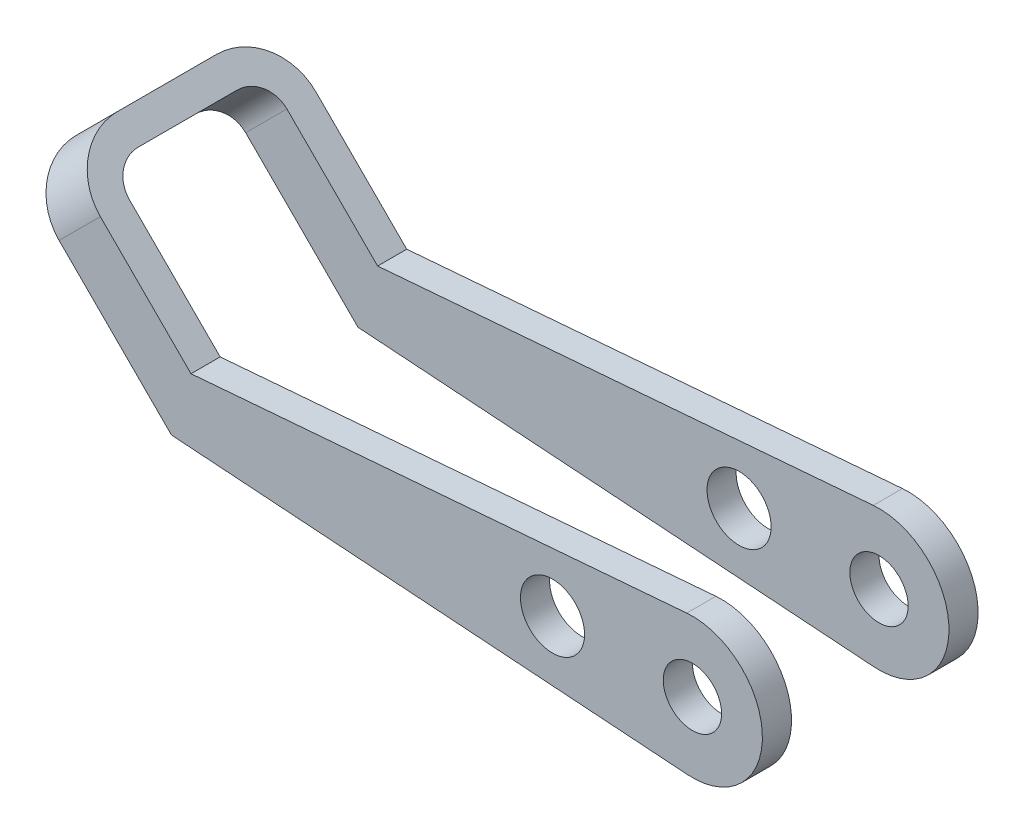
ISO-10303-21;
HEADER;
FILE_DESCRIPTION(('STEP AP214'),'2;1');
FILE_NAME('part.step','',(''),(''),'','','');
FILE_SCHEMA(('AUTOMOTIVE_DESIGN { 1 0 10303 214 1 1 1 1 }'));
ENDSEC;
DATA;
#1=APPLICATION_CONTEXT('core data for automotive mechanical design processes');
#2=APPLICATION_PROTOCOL_DEFINITION('international standard','automotive_design',2000,#1);
#3=PRODUCT_CONTEXT('',#1,'mechanical');
#4=PRODUCT('Part','Part','',(#3));
#5=PRODUCT_RELATED_PRODUCT_CATEGORY('part','',(#4));
#6=PRODUCT_DEFINITION_FORMATION('','',#4);
#7=PRODUCT_DEFINITION_CONTEXT('part definition',#1,'design');
#8=PRODUCT_DEFINITION('design','',#6,#7);
#9=PRODUCT_DEFINITION_SHAPE('','',#8);
#10=(LENGTH_UNIT() NAMED_UNIT(*) SI_UNIT(.MILLI.,.METRE.));
#11=(NAMED_UNIT(*) PLANE_ANGLE_UNIT() SI_UNIT($,.RADIAN.));
#12=(NAMED_UNIT(*) SI_UNIT($,.STERADIAN.) SOLID_ANGLE_UNIT());
#13=UNCERTAINTY_MEASURE_WITH_UNIT(LENGTH_MEASURE(1.E-05),#10,'distance_accuracy_value','');
#14=(GEOMETRIC_REPRESENTATION_CONTEXT(3) GLOBAL_UNCERTAINTY_ASSIGNED_CONTEXT((#13)) GLOBAL_UNIT_ASSIGNED_CONTEXT((#10,
#11,#12)) REPRESENTATION_CONTEXT('',''));
#15=CARTESIAN_POINT('',(0.,0.,0.));
#16=DIRECTION('',(0.,0.,1.));
#17=DIRECTION('',(1.,0.,0.));
#18=AXIS2_PLACEMENT_3D('',#15,#16,#17);
#19=CARTESIAN_POINT('',(0.,0.,-6.75));
#20=DIRECTION('',(0.,0.,1.));
#21=DIRECTION('',(1.,0.,0.));
#22=AXIS2_PLACEMENT_3D('',#19,#20,#21);
#23=PLANE('',#22);
#24=CARTESIAN_POINT('',(-12.,0.,-6.75));
#25=DIRECTION('',(0.,0.,1.));
#26=DIRECTION('',(1.,0.,0.));
#27=AXIS2_PLACEMENT_3D('',#24,#25,#26);
#28=CIRCLE('',#27,2.75);
#29=CARTESIAN_POINT('',(-9.25,0.,-6.75));
#30=VERTEX_POINT('',#29);
#31=EDGE_CURVE('E161',#30,#30,#28,.F.);
#32=ORIENTED_EDGE('',*,*,#31,.T.);
#33=EDGE_LOOP('',(#32));
#34=FACE_BOUND('',#33,.T.);
#35=CARTESIAN_POINT('',(0.,0.,-6.75));
#36=DIRECTION('',(0.,0.,1.));
#37=DIRECTION('',(1.,0.,0.));
#38=AXIS2_PLACEMENT_3D('',#35,#36,#37);
#39=CIRCLE('',#38,2.5);
#40=CARTESIAN_POINT('',(2.5,0.,-6.75));
#41=VERTEX_POINT('',#40);
#42=EDGE_CURVE('E158',#41,#41,#39,.F.);
#43=ORIENTED_EDGE('',*,*,#42,.T.);
#44=EDGE_LOOP('',(#43));
#45=FACE_BOUND('',#44,.T.);
#46=DIRECTION('',(0.99666604494518,0.0815891834334184,0.));
#47=VECTOR('',#46,1.);
#48=CARTESIAN_POINT('',(-21.7447675503,4.239998134836,-6.75));
#49=LINE('',#48,#47);
#50=CARTESIAN_POINT('',(-0.489535100600545,5.97999626967149,-6.75));
#51=VERTEX_POINT('',#50);
#52=CARTESIAN_POINT('',(-42.9999999999997,2.50000000000049,-6.75));
#53=VERTEX_POINT('',#52);
#54=EDGE_CURVE('E152',#51,#53,#49,.F.);
#55=ORIENTED_EDGE('',*,*,#54,.T.);
#56=DIRECTION('',(0.707106781186548,-0.707106781186548,0.));
#57=VECTOR('',#56,1.);
#58=CARTESIAN_POINT('',(-48.21491251125,7.714912511251,-6.75));
#59=LINE('',#58,#57);
#60=CARTESIAN_POINT('',(-50.7781745930497,10.2781745930503,-6.75));
#61=VERTEX_POINT('',#60);
#62=EDGE_CURVE('E239',#53,#61,#59,.F.);
#63=ORIENTED_EDGE('',*,*,#62,.T.);
#64=DIRECTION('',(0.707106781186548,0.707106781186548,0.));
#65=VECTOR('',#64,1.);
#66=CARTESIAN_POINT('',(-50.77817459305,10.27817459305,-6.75));
#67=LINE('',#66,#65);
#68=CARTESIAN_POINT('',(-54.3137084989825,6.742640687117,-6.75));
#69=VERTEX_POINT('',#68);
#70=EDGE_CURVE('E240',#61,#69,#67,.F.);
#71=ORIENTED_EDGE('',*,*,#70,.T.);
#72=DIRECTION('',(-0.707106781186548,0.707106781186548,0.));
#73=VECTOR('',#72,1.);
#74=CARTESIAN_POINT('',(-50.82308071276,3.25201290089,-6.75));
#75=LINE('',#74,#73);
#76=CARTESIAN_POINT('',(-44.6808024970805,-2.89026531478924,-6.75));
#77=VERTEX_POINT('',#76);
#78=EDGE_CURVE('E132',#69,#77,#75,.F.);
#79=ORIENTED_EDGE('',*,*,#78,.T.);
#80=DIRECTION('',(-0.997564050259825,0.0697564737441217,0.));
#81=VECTOR('',#80,1.);
#82=CARTESIAN_POINT('',(-22.54967066977,-4.437824808174,-6.75));
#83=LINE('',#82,#81);
#84=CARTESIAN_POINT('',(-0.418538842464712,-5.98538430155894,-6.75));
#85=VERTEX_POINT('',#84);
#86=EDGE_CURVE('E129',#77,#85,#83,.F.);
#87=ORIENTED_EDGE('',*,*,#86,.T.);
#88=CARTESIAN_POINT('',(0.,0.,-6.75));
#89=DIRECTION('',(0.,0.,1.));
#90=DIRECTION('',(1.,0.,0.));
#91=AXIS2_PLACEMENT_3D('',#88,#89,#90);
#92=CIRCLE('',#91,6.);
#93=EDGE_CURVE('E20',#51,#85,#92,.F.);
#94=ORIENTED_EDGE('',*,*,#93,.F.);
#95=EDGE_LOOP('',(#55,#63,#71,#79,#87,#94));
#96=FACE_BOUND('',#95,.T.);
#97=ADVANCED_FACE('F17',(#34,#45,#96),#23,.T.);
#98=CARTESIAN_POINT('',(-22.54967066977,-4.437824808174,-8.));
#99=DIRECTION('',(0.0697564737441217,0.997564050259825,0.));
#100=DIRECTION('',(-0.997564050259825,0.0697564737441217,0.));
#101=AXIS2_PLACEMENT_3D('',#98,#99,#100);
#102=PLANE('',#101);
#103=ORIENTED_EDGE('',*,*,#86,.F.);
#104=DIRECTION('',(0.,0.,1.));
#105=VECTOR('',#104,1.);
#106=CARTESIAN_POINT('',(-44.6808024970805,-2.8902653147895,-8.));
#107=LINE('',#106,#105);
#108=CARTESIAN_POINT('',(-44.6808024970802,-2.89026531478917,-9.25));
#109=VERTEX_POINT('',#108);
#110=EDGE_CURVE('E229',#77,#109,#107,.F.);
#111=ORIENTED_EDGE('',*,*,#110,.T.);
#112=DIRECTION('',(0.997564050259825,-0.0697564737441172,0.));
#113=VECTOR('',#112,1.);
#114=CARTESIAN_POINT('',(-44.68080249708,-2.890265314789,-9.25));
#115=LINE('',#114,#113);
#116=CARTESIAN_POINT('',(-0.418538842464701,-5.98538430155898,-9.25));
#117=VERTEX_POINT('',#116);
#118=EDGE_CURVE('E140',#109,#117,#115,.T.);
#119=ORIENTED_EDGE('',*,*,#118,.T.);
#120=DIRECTION('',(0.,0.,1.));
#121=VECTOR('',#120,1.);
#122=CARTESIAN_POINT('',(-0.418538842464695,-5.98538430155895,-8.));
#123=LINE('',#122,#121);
#124=EDGE_CURVE('E137',#85,#117,#123,.F.);
#125=ORIENTED_EDGE('',*,*,#124,.F.);
#126=EDGE_LOOP('',(#103,#111,#119,#125));
#127=FACE_BOUND('',#126,.T.);
#128=ADVANCED_FACE('F138',(#127),#102,.F.);
#129=CARTESIAN_POINT('',(0.,0.,-8.));
#130=DIRECTION('',(0.,0.,1.));
#131=DIRECTION('',(1.,0.,0.));
#132=AXIS2_PLACEMENT_3D('',#129,#130,#131);
#133=CYLINDRICAL_SURFACE('',#132,6.);
#134=ORIENTED_EDGE('',*,*,#124,.T.);
#135=CARTESIAN_POINT('',(0.,0.,-9.25));
#136=DIRECTION('',(0.,0.,1.));
#137=DIRECTION('',(1.,0.,0.));
#138=AXIS2_PLACEMENT_3D('',#135,#136,#137);
#139=CIRCLE('',#138,6.);
#140=CARTESIAN_POINT('',(-0.489535100600522,5.97999626967124,-9.25));
#141=VERTEX_POINT('',#140);
#142=EDGE_CURVE('E148',#117,#141,#139,.T.);
#143=ORIENTED_EDGE('',*,*,#142,.T.);
#144=DIRECTION('',(0.,0.,1.));
#145=VECTOR('',#144,1.);
#146=CARTESIAN_POINT('',(-0.489535100600545,5.97999626967149,-8.));
#147=LINE('',#146,#145);
#148=EDGE_CURVE('E143',#141,#51,#147,.T.);
#149=ORIENTED_EDGE('',*,*,#148,.T.);
#150=ORIENTED_EDGE('',*,*,#93,.T.);
#151=EDGE_LOOP('',(#134,#143,#149,#150));
#152=FACE_BOUND('',#151,.T.);
#153=ADVANCED_FACE('F145',(#152),#133,.T.);
#154=CARTESIAN_POINT('',(-21.7447675503,4.239998134836,-8.));
#155=DIRECTION('',(0.0815891834334184,-0.99666604494518,0.));
#156=DIRECTION('',(0.99666604494518,0.0815891834334184,0.));
#157=AXIS2_PLACEMENT_3D('',#154,#155,#156);
#158=PLANE('',#157);
#159=ORIENTED_EDGE('',*,*,#54,.F.);
#160=ORIENTED_EDGE('',*,*,#148,.F.);
#161=DIRECTION('',(-0.99666604494518,-0.0815891834334178,0.));
#162=VECTOR('',#161,1.);
#163=CARTESIAN_POINT('',(-0.4895351006005,5.979996269671,-9.25));
#164=LINE('',#163,#162);
#165=CARTESIAN_POINT('',(-42.9999999999998,2.50000000000016,-9.25));
#166=VERTEX_POINT('',#165);
#167=EDGE_CURVE('E224',#141,#166,#164,.T.);
#168=ORIENTED_EDGE('',*,*,#167,.T.);
#169=DIRECTION('',(0.,0.,1.));
#170=VECTOR('',#169,1.);
#171=CARTESIAN_POINT('',(-42.9999999999995,2.5000000000005,-8.));
#172=LINE('',#171,#170);
#173=EDGE_CURVE('E156',#166,#53,#172,.T.);
#174=ORIENTED_EDGE('',*,*,#173,.T.);
#175=EDGE_LOOP('',(#159,#160,#168,#174));
#176=FACE_BOUND('',#175,.T.);
#177=ADVANCED_FACE('F155',(#176),#158,.F.);
#178=CARTESIAN_POINT('',(0.,0.,-8.));
#179=DIRECTION('',(0.,0.,1.));
#180=DIRECTION('',(1.,0.,0.));
#181=AXIS2_PLACEMENT_3D('',#178,#179,#180);
#182=CYLINDRICAL_SURFACE('',#181,2.5);
#183=ORIENTED_EDGE('',*,*,#42,.F.);
#184=EDGE_LOOP('',(#183));
#185=FACE_BOUND('',#184,.T.);
#186=CARTESIAN_POINT('',(0.,0.,-9.25));
#187=DIRECTION('',(0.,0.,1.));
#188=DIRECTION('',(1.,0.,0.));
#189=AXIS2_PLACEMENT_3D('',#186,#187,#188);
#190=CIRCLE('',#189,2.5);
#191=CARTESIAN_POINT('',(2.5,0.,-9.25));
#192=VERTEX_POINT('',#191);
#193=EDGE_CURVE('E221',#192,#192,#190,.F.);
#194=ORIENTED_EDGE('',*,*,#193,.T.);
#195=EDGE_LOOP('',(#194));
#196=FACE_BOUND('',#195,.T.);
#197=ADVANCED_FACE('F520',(#185,#196),#182,.F.);
#198=CARTESIAN_POINT('',(-12.,0.,-8.));
#199=DIRECTION('',(0.,0.,1.));
#200=DIRECTION('',(1.,0.,0.));
#201=AXIS2_PLACEMENT_3D('',#198,#199,#200);
#202=CYLINDRICAL_SURFACE('',#201,2.75);
#203=ORIENTED_EDGE('',*,*,#31,.F.);
#204=EDGE_LOOP('',(#203));
#205=FACE_BOUND('',#204,.T.);
#206=CARTESIAN_POINT('',(-12.,0.,-9.25));
#207=DIRECTION('',(0.,0.,1.));
#208=DIRECTION('',(1.,0.,0.));
#209=AXIS2_PLACEMENT_3D('',#206,#207,#208);
#210=CIRCLE('',#209,2.75);
#211=CARTESIAN_POINT('',(-9.25,0.,-9.25));
#212=VERTEX_POINT('',#211);
#213=EDGE_CURVE('E218',#212,#212,#210,.F.);
#214=ORIENTED_EDGE('',*,*,#213,.T.);
#215=EDGE_LOOP('',(#214));
#216=FACE_BOUND('',#215,.T.);
#217=ADVANCED_FACE('F512',(#205,#216),#202,.F.);
#218=CARTESIAN_POINT('',(-50.77817459305,10.27817459305,-4.25));
#219=DIRECTION('',(0.707106781186548,0.707106781186548,0.));
#220=DIRECTION('',(-0.707106781186548,0.707106781186548,0.));
#221=AXIS2_PLACEMENT_3D('',#218,#219,#220);
#222=CYLINDRICAL_SURFACE('',#221,2.5);
#223=DIRECTION('',(-0.707106781186548,-0.707106781186548,0.));
#224=VECTOR('',#223,1.);
#225=CARTESIAN_POINT('',(-52.54594154602,12.04594154602,-4.25));
#226=LINE('',#225,#224);
#227=CARTESIAN_POINT('',(-52.5459415460182,12.0459415460182,-4.25));
#228=VERTEX_POINT('',#227);
#229=CARTESIAN_POINT('',(-56.0814754519487,8.51040764008769,-4.25));
#230=VERTEX_POINT('',#229);
#231=EDGE_CURVE('E212',#228,#230,#226,.T.);
#232=ORIENTED_EDGE('',*,*,#231,.T.);
#233=CARTESIAN_POINT('',(-54.3137084989805,6.7426406871195,-4.25));
#234=DIRECTION('',(0.707106781186548,0.707106781186548,0.));
#235=DIRECTION('',(-0.707106781186548,0.707106781186548,0.));
#236=AXIS2_PLACEMENT_3D('',#233,#234,#235);
#237=CIRCLE('',#236,2.5);
#238=EDGE_CURVE('E215',#69,#230,#237,.T.);
#239=ORIENTED_EDGE('',*,*,#238,.F.);
#240=ORIENTED_EDGE('',*,*,#70,.F.);
#241=CARTESIAN_POINT('',(-50.77817459305,10.27817459305,-4.25));
#242=DIRECTION('',(0.707106781186548,0.707106781186548,0.));
#243=DIRECTION('',(-0.707106781186548,0.707106781186548,0.));
#244=AXIS2_PLACEMENT_3D('',#241,#242,#243);
#245=CIRCLE('',#244,2.5);
#246=EDGE_CURVE('E213',#61,#228,#245,.T.);
#247=ORIENTED_EDGE('',*,*,#246,.T.);
#248=EDGE_LOOP('',(#232,#239,#240,#247));
#249=FACE_BOUND('',#248,.T.);
#250=ADVANCED_FACE('F363',(#249),#222,.F.);
#251=CARTESIAN_POINT('',(0.,0.,-9.25));
#252=DIRECTION('',(0.,0.,1.));
#253=DIRECTION('',(1.,0.,0.));
#254=AXIS2_PLACEMENT_3D('',#251,#252,#253);
#255=PLANE('',#254);
#256=ORIENTED_EDGE('',*,*,#213,.F.);
#257=EDGE_LOOP('',(#256));
#258=FACE_BOUND('',#257,.T.);
#259=ORIENTED_EDGE('',*,*,#193,.F.);
#260=EDGE_LOOP('',(#259));
#261=FACE_BOUND('',#260,.T.);
#262=ORIENTED_EDGE('',*,*,#142,.F.);
#263=ORIENTED_EDGE('',*,*,#118,.F.);
#264=DIRECTION('',(0.707106781186254,-0.707106781186841,0.));
#265=VECTOR('',#264,1.);
#266=CARTESIAN_POINT('',(-54.31370849898,6.742640687119,-9.25));
#267=LINE('',#266,#265);
#268=CARTESIAN_POINT('',(-54.3137084989802,6.74264068711925,-9.25));
#269=VERTEX_POINT('',#268);
#270=EDGE_CURVE('E247',#269,#109,#267,.T.);
#271=ORIENTED_EDGE('',*,*,#270,.F.);
#272=DIRECTION('',(0.707106781186548,0.707106781186548,0.));
#273=VECTOR('',#272,1.);
#274=CARTESIAN_POINT('',(-50.77817459305,10.27817459305,-9.25));
#275=LINE('',#274,#273);
#276=CARTESIAN_POINT('',(-50.77817459305,10.27817459305,-9.25));
#277=VERTEX_POINT('',#276);
#278=EDGE_CURVE('E208',#277,#269,#275,.F.);
#279=ORIENTED_EDGE('',*,*,#278,.F.);
#280=DIRECTION('',(-0.707106781186547,0.707106781186548,0.));
#281=VECTOR('',#280,1.);
#282=CARTESIAN_POINT('',(-43.,2.5,-9.25));
#283=LINE('',#282,#281);
#284=EDGE_CURVE('E242',#166,#277,#283,.T.);
#285=ORIENTED_EDGE('',*,*,#284,.F.);
#286=ORIENTED_EDGE('',*,*,#167,.F.);
#287=EDGE_LOOP('',(#262,#263,#271,#279,#285,#286));
#288=FACE_BOUND('',#287,.T.);
#289=ADVANCED_FACE('F367',(#258,#261,#288),#255,.F.);
#290=CARTESIAN_POINT('',(-52.54594154602,12.04594154602,-9.25));
#291=DIRECTION('',(-0.707106781186548,0.707106781186548,0.));
#292=DIRECTION('',(-0.707106781186548,-0.707106781186548,0.));
#293=AXIS2_PLACEMENT_3D('',#290,#291,#292);
#294=PLANE('',#293);
#295=DIRECTION('',(-0.707106781186548,-0.707106781186548,0.));
#296=VECTOR('',#295,1.);
#297=CARTESIAN_POINT('',(-52.5459415460164,12.0459415460164,4.25));
#298=LINE('',#297,#296);
#299=CARTESIAN_POINT('',(-52.5459415460182,12.0459415460182,4.25));
#300=VERTEX_POINT('',#299);
#301=CARTESIAN_POINT('',(-56.0814754519484,8.51040764008594,4.25));
#302=VERTEX_POINT('',#301);
#303=EDGE_CURVE('E269',#300,#302,#298,.T.);
#304=ORIENTED_EDGE('',*,*,#303,.T.);
#305=DIRECTION('',(0.,0.,1.));
#306=VECTOR('',#305,1.);
#307=CARTESIAN_POINT('',(-56.0814754519485,8.5104076400875,0.));
#308=LINE('',#307,#306);
#309=EDGE_CURVE('E255',#230,#302,#308,.T.);
#310=ORIENTED_EDGE('',*,*,#309,.F.);
#311=ORIENTED_EDGE('',*,*,#231,.F.);
#312=DIRECTION('',(0.,0.,1.));
#313=VECTOR('',#312,1.);
#314=CARTESIAN_POINT('',(-52.54594154602,12.04594154602,0.));
#315=LINE('',#314,#313);
#316=EDGE_CURVE('E268',#228,#300,#315,.T.);
#317=ORIENTED_EDGE('',*,*,#316,.T.);
#318=EDGE_LOOP('',(#304,#310,#311,#317));
#319=FACE_BOUND('',#318,.T.);
#320=ADVANCED_FACE('F360',(#319),#294,.F.);
#321=CARTESIAN_POINT('',(-50.77817459305,10.27817459305,-4.25));
#322=DIRECTION('',(0.707106781186548,0.707106781186548,0.));
#323=DIRECTION('',(-0.707106781186548,0.707106781186548,0.));
#324=AXIS2_PLACEMENT_3D('',#321,#322,#323);
#325=CYLINDRICAL_SURFACE('',#324,5.);
#326=CARTESIAN_POINT('',(-50.77817459305,10.27817459305,-4.25));
#327=DIRECTION('',(0.707106781186548,0.707106781186548,0.));
#328=DIRECTION('',(-0.707106781186548,0.707106781186548,0.));
#329=AXIS2_PLACEMENT_3D('',#326,#327,#328);
#330=CIRCLE('',#329,5.);
#331=CARTESIAN_POINT('',(-54.3137084989814,13.8137084989814,-4.25));
#332=VERTEX_POINT('',#331);
#333=EDGE_CURVE('E205',#332,#277,#330,.F.);
#334=ORIENTED_EDGE('',*,*,#333,.T.);
#335=ORIENTED_EDGE('',*,*,#278,.T.);
#336=CARTESIAN_POINT('',(-54.3137084989805,6.7426406871195,-4.25));
#337=DIRECTION('',(0.707106781186548,0.707106781186548,0.));
#338=DIRECTION('',(-0.707106781186548,0.707106781186548,0.));
#339=AXIS2_PLACEMENT_3D('',#336,#337,#338);
#340=CIRCLE('',#339,5.);
#341=CARTESIAN_POINT('',(-57.8492424049141,10.2781745930486,-4.25));
#342=VERTEX_POINT('',#341);
#343=EDGE_CURVE('E209',#269,#342,#340,.T.);
#344=ORIENTED_EDGE('',*,*,#343,.T.);
#345=DIRECTION('',(-0.707106781186548,-0.707106781186548,0.));
#346=VECTOR('',#345,1.);
#347=CARTESIAN_POINT('',(-54.31370849898,13.81370849898,-4.25));
#348=LINE('',#347,#346);
#349=EDGE_CURVE('E204',#332,#342,#348,.T.);
#350=ORIENTED_EDGE('',*,*,#349,.F.);
#351=EDGE_LOOP('',(#334,#335,#344,#350));
#352=FACE_BOUND('',#351,.T.);
#353=ADVANCED_FACE('F371',(#352),#325,.T.);
#354=CARTESIAN_POINT('',(-50.77817459305,10.27817459305,4.25));
#355=DIRECTION('',(-0.707106781186548,-0.707106781186548,0.));
#356=DIRECTION('',(0.707106781186548,-0.707106781186548,0.));
#357=AXIS2_PLACEMENT_3D('',#354,#355,#356);
#358=CYLINDRICAL_SURFACE('',#357,2.5);
#359=ORIENTED_EDGE('',*,*,#303,.F.);
#360=CARTESIAN_POINT('',(-50.77817459305,10.27817459305,4.25));
#361=DIRECTION('',(-0.707106781186548,-0.707106781186548,0.));
#362=DIRECTION('',(0.707106781186548,-0.707106781186548,0.));
#363=AXIS2_PLACEMENT_3D('',#360,#361,#362);
#364=CIRCLE('',#363,2.5);
#365=CARTESIAN_POINT('',(-50.7781745930497,10.2781745930503,6.75));
#366=VERTEX_POINT('',#365);
#367=EDGE_CURVE('E198',#366,#300,#364,.T.);
#368=ORIENTED_EDGE('',*,*,#367,.F.);
#369=DIRECTION('',(-0.707106781186447,-0.707106781186648,0.));
#370=VECTOR('',#369,1.);
#371=CARTESIAN_POINT('',(-50.77817459305,10.27817459305,6.75));
#372=LINE('',#371,#370);
#373=CARTESIAN_POINT('',(-54.3137084989832,6.74264068711625,6.75));
#374=VERTEX_POINT('',#373);
#375=EDGE_CURVE('E197',#366,#374,#372,.T.);
#376=ORIENTED_EDGE('',*,*,#375,.T.);
#377=CARTESIAN_POINT('',(-54.313708498982,6.742640687118,4.25));
#378=DIRECTION('',(-0.707106781186548,-0.707106781186548,0.));
#379=DIRECTION('',(0.707106781186548,-0.707106781186548,0.));
#380=AXIS2_PLACEMENT_3D('',#377,#378,#379);
#381=CIRCLE('',#380,2.5);
#382=EDGE_CURVE('E201',#374,#302,#381,.T.);
#383=ORIENTED_EDGE('',*,*,#382,.T.);
#384=EDGE_LOOP('',(#359,#368,#376,#383));
#385=FACE_BOUND('',#384,.T.);
#386=ADVANCED_FACE('F355',(#385),#358,.F.);
#387=CARTESIAN_POINT('',(-54.31370849898,13.81370849898,-9.25));
#388=DIRECTION('',(-0.707106781186548,0.707106781186548,0.));
#389=DIRECTION('',(-0.707106781186548,-0.707106781186548,0.));
#390=AXIS2_PLACEMENT_3D('',#387,#388,#389);
#391=PLANE('',#390);
#392=DIRECTION('',(0.,0.,1.));
#393=VECTOR('',#392,1.);
#394=CARTESIAN_POINT('',(-54.31370849898,13.81370849898,-9.25));
#395=LINE('',#394,#393);
#396=CARTESIAN_POINT('',(-54.3137084989814,13.8137084989814,4.25));
#397=VERTEX_POINT('',#396);
#398=EDGE_CURVE('E265',#397,#332,#395,.F.);
#399=ORIENTED_EDGE('',*,*,#398,.T.);
#400=ORIENTED_EDGE('',*,*,#349,.T.);
#401=DIRECTION('',(0.,0.,1.));
#402=VECTOR('',#401,1.);
#403=CARTESIAN_POINT('',(-57.849242404915,10.278174593045,-9.25));
#404=LINE('',#403,#402);
#405=CARTESIAN_POINT('',(-57.8492424049141,10.2781745930486,4.25));
#406=VERTEX_POINT('',#405);
#407=EDGE_CURVE('E271',#342,#406,#404,.T.);
#408=ORIENTED_EDGE('',*,*,#407,.T.);
#409=DIRECTION('',(-0.707106781186548,-0.707106781186548,0.));
#410=VECTOR('',#409,1.);
#411=CARTESIAN_POINT('',(-54.3137084989827,13.8137084989827,4.25));
#412=LINE('',#411,#410);
#413=EDGE_CURVE('E193',#397,#406,#412,.T.);
#414=ORIENTED_EDGE('',*,*,#413,.F.);
#415=EDGE_LOOP('',(#399,#400,#408,#414));
#416=FACE_BOUND('',#415,.T.);
#417=ADVANCED_FACE('F373',(#416),#391,.T.);
#418=CARTESIAN_POINT('',(0.,0.,6.75));
#419=DIRECTION('',(0.,0.,1.));
#420=DIRECTION('',(1.,0.,0.));
#421=AXIS2_PLACEMENT_3D('',#418,#419,#420);
#422=PLANE('',#421);
#423=CARTESIAN_POINT('',(-12.,0.,6.75));
#424=DIRECTION('',(0.,0.,1.));
#425=DIRECTION('',(1.,0.,0.));
#426=AXIS2_PLACEMENT_3D('',#423,#424,#425);
#427=CIRCLE('',#426,2.75);
#428=CARTESIAN_POINT('',(-9.25,0.,6.75));
#429=VERTEX_POINT('',#428);
#430=EDGE_CURVE('E178',#429,#429,#427,.T.);
#431=ORIENTED_EDGE('',*,*,#430,.T.);
#432=EDGE_LOOP('',(#431));
#433=FACE_BOUND('',#432,.T.);
#434=CARTESIAN_POINT('',(0.,0.,6.75));
#435=DIRECTION('',(0.,0.,1.));
#436=DIRECTION('',(1.,0.,0.));
#437=AXIS2_PLACEMENT_3D('',#434,#435,#436);
#438=CIRCLE('',#437,2.5);
#439=CARTESIAN_POINT('',(2.5,0.,6.75));
#440=VERTEX_POINT('',#439);
#441=EDGE_CURVE('E182',#440,#440,#438,.T.);
#442=ORIENTED_EDGE('',*,*,#441,.T.);
#443=EDGE_LOOP('',(#442));
#444=FACE_BOUND('',#443,.T.);
#445=CARTESIAN_POINT('',(0.,0.,6.75));
#446=DIRECTION('',(0.,0.,1.));
#447=DIRECTION('',(1.,0.,0.));
#448=AXIS2_PLACEMENT_3D('',#445,#446,#447);
#449=CIRCLE('',#448,6.);
#450=CARTESIAN_POINT('',(-0.418538842464712,-5.98538430155894,6.75));
#451=VERTEX_POINT('',#450);
#452=CARTESIAN_POINT('',(-0.489535100600545,5.97999626967149,6.75));
#453=VERTEX_POINT('',#452);
#454=EDGE_CURVE('E186',#451,#453,#449,.T.);
#455=ORIENTED_EDGE('',*,*,#454,.F.);
#456=DIRECTION('',(0.997564050259825,-0.0697564737441217,0.));
#457=VECTOR('',#456,1.);
#458=CARTESIAN_POINT('',(-22.54967066977,-4.437824808174,6.75));
#459=LINE('',#458,#457);
#460=CARTESIAN_POINT('',(-44.6808024970802,-2.89026531478899,6.75));
#461=VERTEX_POINT('',#460);
#462=EDGE_CURVE('E284',#461,#451,#459,.T.);
#463=ORIENTED_EDGE('',*,*,#462,.F.);
#464=DIRECTION('',(0.707106781186548,-0.707106781186548,0.));
#465=VECTOR('',#464,1.);
#466=CARTESIAN_POINT('',(-50.82308071276,3.25201290089,6.75));
#467=LINE('',#466,#465);
#468=EDGE_CURVE('E192',#374,#461,#467,.T.);
#469=ORIENTED_EDGE('',*,*,#468,.F.);
#470=ORIENTED_EDGE('',*,*,#375,.F.);
#471=DIRECTION('',(-0.707106781186548,0.707106781186548,0.));
#472=VECTOR('',#471,1.);
#473=CARTESIAN_POINT('',(-48.21491251125,7.714912511251,6.75));
#474=LINE('',#473,#472);
#475=CARTESIAN_POINT('',(-42.9999999999997,2.50000000000049,6.75));
#476=VERTEX_POINT('',#475);
#477=EDGE_CURVE('E185',#476,#366,#474,.T.);
#478=ORIENTED_EDGE('',*,*,#477,.F.);
#479=DIRECTION('',(-0.99666604494518,-0.0815891834334184,0.));
#480=VECTOR('',#479,1.);
#481=CARTESIAN_POINT('',(-21.7447675503,4.239998134836,6.75));
#482=LINE('',#481,#480);
#483=EDGE_CURVE('E288',#453,#476,#482,.T.);
#484=ORIENTED_EDGE('',*,*,#483,.F.);
#485=EDGE_LOOP('',(#455,#463,#469,#470,#478,#484));
#486=FACE_BOUND('',#485,.T.);
#487=ADVANCED_FACE('F335',(#433,#444,#486),#422,.F.);
#488=CARTESIAN_POINT('',(-50.77817459305,10.27817459305,4.25));
#489=DIRECTION('',(-0.707106781186548,-0.707106781186548,0.));
#490=DIRECTION('',(0.707106781186548,-0.707106781186548,0.));
#491=AXIS2_PLACEMENT_3D('',#488,#489,#490);
#492=CYLINDRICAL_SURFACE('',#491,5.);
#493=CARTESIAN_POINT('',(-54.313708498985,6.742640687115,4.25));
#494=DIRECTION('',(-0.707106781186548,-0.707106781186548,0.));
#495=DIRECTION('',(0.707106781186548,-0.707106781186548,0.));
#496=AXIS2_PLACEMENT_3D('',#493,#494,#495);
#497=CIRCLE('',#496,5.);
#498=CARTESIAN_POINT('',(-54.3137084989825,6.742640687117,9.25));
#499=VERTEX_POINT('',#498);
#500=EDGE_CURVE('E190',#406,#499,#497,.F.);
#501=ORIENTED_EDGE('',*,*,#500,.T.);
#502=DIRECTION('',(-0.707106781186447,-0.707106781186648,0.));
#503=VECTOR('',#502,1.);
#504=CARTESIAN_POINT('',(-50.77817459305,10.27817459305,9.25));
#505=LINE('',#504,#503);
#506=CARTESIAN_POINT('',(-50.7781745930497,10.2781745930503,9.25));
#507=VERTEX_POINT('',#506);
#508=EDGE_CURVE('E181',#507,#499,#505,.T.);
#509=ORIENTED_EDGE('',*,*,#508,.F.);
#510=CARTESIAN_POINT('',(-50.77817459305,10.27817459305,4.25));
#511=DIRECTION('',(-0.707106781186548,-0.707106781186548,0.));
#512=DIRECTION('',(0.707106781186548,-0.707106781186548,0.));
#513=AXIS2_PLACEMENT_3D('',#510,#511,#512);
#514=CIRCLE('',#513,5.);
#515=EDGE_CURVE('E194',#507,#397,#514,.T.);
#516=ORIENTED_EDGE('',*,*,#515,.T.);
#517=ORIENTED_EDGE('',*,*,#413,.T.);
#518=EDGE_LOOP('',(#501,#509,#516,#517));
#519=FACE_BOUND('',#518,.T.);
#520=ADVANCED_FACE('F343',(#519),#492,.T.);
#521=CARTESIAN_POINT('',(-50.82308071276,3.25201290089,8.));
#522=DIRECTION('',(-0.707106781186548,-0.707106781186548,0.));
#523=DIRECTION('',(0.707106781186548,-0.707106781186548,0.));
#524=AXIS2_PLACEMENT_3D('',#521,#522,#523);
#525=PLANE('',#524);
#526=DIRECTION('',(0.707106781186254,-0.707106781186841,0.));
#527=VECTOR('',#526,1.);
#528=CARTESIAN_POINT('',(-54.31370849898,6.742640687119,9.25));
#529=LINE('',#528,#527);
#530=CARTESIAN_POINT('',(-44.68080249708,-2.89026531478891,9.25));
#531=VERTEX_POINT('',#530);
#532=EDGE_CURVE('E297',#499,#531,#529,.T.);
#533=ORIENTED_EDGE('',*,*,#532,.F.);
#534=ORIENTED_EDGE('',*,*,#500,.F.);
#535=ORIENTED_EDGE('',*,*,#407,.F.);
#536=ORIENTED_EDGE('',*,*,#343,.F.);
#537=ORIENTED_EDGE('',*,*,#270,.T.);
#538=ORIENTED_EDGE('',*,*,#110,.F.);
#539=ORIENTED_EDGE('',*,*,#78,.F.);
#540=ORIENTED_EDGE('',*,*,#238,.T.);
#541=ORIENTED_EDGE('',*,*,#309,.T.);
#542=ORIENTED_EDGE('',*,*,#382,.F.);
#543=ORIENTED_EDGE('',*,*,#468,.T.);
#544=DIRECTION('',(0.,0.,1.));
#545=VECTOR('',#544,1.);
#546=CARTESIAN_POINT('',(-44.68080249708,-2.89026531478874,8.));
#547=LINE('',#546,#545);
#548=EDGE_CURVE('E281',#531,#461,#547,.F.);
#549=ORIENTED_EDGE('',*,*,#548,.F.);
#550=EDGE_LOOP('',(#533,#534,#535,#536,#537,#538,#539,#540,#541,#542,#543,#549));
#551=FACE_BOUND('',#550,.T.);
#552=ADVANCED_FACE('F348',(#551),#525,.T.);
#553=CARTESIAN_POINT('',(-22.54967066977,-4.437824808174,8.));
#554=DIRECTION('',(-0.0697564737441217,-0.997564050259825,0.));
#555=DIRECTION('',(0.997564050259825,-0.0697564737441217,0.));
#556=AXIS2_PLACEMENT_3D('',#553,#554,#555);
#557=PLANE('',#556);
#558=DIRECTION('',(0.,0.,1.));
#559=VECTOR('',#558,1.);
#560=CARTESIAN_POINT('',(-0.418538842464695,-5.98538430155895,8.));
#561=LINE('',#560,#559);
#562=CARTESIAN_POINT('',(-0.418538842464701,-5.98538430155898,9.25));
#563=VERTEX_POINT('',#562);
#564=EDGE_CURVE('E189',#563,#451,#561,.F.);
#565=ORIENTED_EDGE('',*,*,#564,.F.);
#566=DIRECTION('',(0.997564050259825,-0.0697564737441172,0.));
#567=VECTOR('',#566,1.);
#568=CARTESIAN_POINT('',(-44.68080249708,-2.890265314789,9.25));
#569=LINE('',#568,#567);
#570=EDGE_CURVE('E177',#531,#563,#569,.T.);
#571=ORIENTED_EDGE('',*,*,#570,.F.);
#572=ORIENTED_EDGE('',*,*,#548,.T.);
#573=ORIENTED_EDGE('',*,*,#462,.T.);
#574=EDGE_LOOP('',(#565,#571,#572,#573));
#575=FACE_BOUND('',#574,.T.);
#576=ADVANCED_FACE('F351',(#575),#557,.T.);
#577=CARTESIAN_POINT('',(0.,0.,8.));
#578=DIRECTION('',(0.,0.,1.));
#579=DIRECTION('',(1.,0.,0.));
#580=AXIS2_PLACEMENT_3D('',#577,#578,#579);
#581=CYLINDRICAL_SURFACE('',#580,6.);
#582=DIRECTION('',(0.,0.,1.));
#583=VECTOR('',#582,1.);
#584=CARTESIAN_POINT('',(-0.489535100600545,5.97999626967149,8.));
#585=LINE('',#584,#583);
#586=CARTESIAN_POINT('',(-0.489535100600522,5.97999626967124,9.25));
#587=VERTEX_POINT('',#586);
#588=EDGE_CURVE('E188',#587,#453,#585,.F.);
#589=ORIENTED_EDGE('',*,*,#588,.F.);
#590=CARTESIAN_POINT('',(0.,0.,9.25));
#591=DIRECTION('',(0.,0.,1.));
#592=DIRECTION('',(1.,0.,0.));
#593=AXIS2_PLACEMENT_3D('',#590,#591,#592);
#594=CIRCLE('',#593,6.);
#595=EDGE_CURVE('E173',#563,#587,#594,.T.);
#596=ORIENTED_EDGE('',*,*,#595,.F.);
#597=ORIENTED_EDGE('',*,*,#564,.T.);
#598=ORIENTED_EDGE('',*,*,#454,.T.);
#599=EDGE_LOOP('',(#589,#596,#597,#598));
#600=FACE_BOUND('',#599,.T.);
#601=ADVANCED_FACE('F331',(#600),#581,.T.);
#602=CARTESIAN_POINT('',(-21.7447675503,4.239998134836,8.));
#603=DIRECTION('',(-0.0815891834334184,0.99666604494518,0.));
#604=DIRECTION('',(-0.99666604494518,-0.0815891834334184,0.));
#605=AXIS2_PLACEMENT_3D('',#602,#603,#604);
#606=PLANE('',#605);
#607=DIRECTION('',(0.,0.,1.));
#608=VECTOR('',#607,1.);
#609=CARTESIAN_POINT('',(-42.9999999999995,2.5000000000005,8.));
#610=LINE('',#609,#608);
#611=CARTESIAN_POINT('',(-42.9999999999998,2.50000000000017,9.25));
#612=VERTEX_POINT('',#611);
#613=EDGE_CURVE('E35',#612,#476,#610,.F.);
#614=ORIENTED_EDGE('',*,*,#613,.F.);
#615=DIRECTION('',(-0.99666604494518,-0.0815891834334178,0.));
#616=VECTOR('',#615,1.);
#617=CARTESIAN_POINT('',(-0.4895351006005,5.979996269671,9.25));
#618=LINE('',#617,#616);
#619=EDGE_CURVE('E176',#587,#612,#618,.T.);
#620=ORIENTED_EDGE('',*,*,#619,.F.);
#621=ORIENTED_EDGE('',*,*,#588,.T.);
#622=ORIENTED_EDGE('',*,*,#483,.T.);
#623=EDGE_LOOP('',(#614,#620,#621,#622));
#624=FACE_BOUND('',#623,.T.);
#625=ADVANCED_FACE('F327',(#624),#606,.T.);
#626=CARTESIAN_POINT('',(-48.21491251125,7.714912511251,8.));
#627=DIRECTION('',(0.707106781186548,0.707106781186548,0.));
#628=DIRECTION('',(-0.707106781186548,0.707106781186548,0.));
#629=AXIS2_PLACEMENT_3D('',#626,#627,#628);
#630=PLANE('',#629);
#631=ORIENTED_EDGE('',*,*,#477,.T.);
#632=ORIENTED_EDGE('',*,*,#367,.T.);
#633=ORIENTED_EDGE('',*,*,#316,.F.);
#634=ORIENTED_EDGE('',*,*,#246,.F.);
#635=ORIENTED_EDGE('',*,*,#62,.F.);
#636=ORIENTED_EDGE('',*,*,#173,.F.);
#637=ORIENTED_EDGE('',*,*,#284,.T.);
#638=ORIENTED_EDGE('',*,*,#333,.F.);
#639=ORIENTED_EDGE('',*,*,#398,.F.);
#640=ORIENTED_EDGE('',*,*,#515,.F.);
#641=DIRECTION('',(-0.707106781186547,0.707106781186548,0.));
#642=VECTOR('',#641,1.);
#643=CARTESIAN_POINT('',(-43.,2.5,9.25));
#644=LINE('',#643,#642);
#645=EDGE_CURVE('E172',#612,#507,#644,.T.);
#646=ORIENTED_EDGE('',*,*,#645,.F.);
#647=ORIENTED_EDGE('',*,*,#613,.T.);
#648=EDGE_LOOP('',(#631,#632,#633,#634,#635,#636,#637,#638,#639,#640,#646,#647));
#649=FACE_BOUND('',#648,.T.);
#650=ADVANCED_FACE('F339',(#649),#630,.T.);
#651=CARTESIAN_POINT('',(0.,0.,8.));
#652=DIRECTION('',(0.,0.,1.));
#653=DIRECTION('',(1.,0.,0.));
#654=AXIS2_PLACEMENT_3D('',#651,#652,#653);
#655=CYLINDRICAL_SURFACE('',#654,2.5);
#656=ORIENTED_EDGE('',*,*,#441,.F.);
#657=EDGE_LOOP('',(#656));
#658=FACE_BOUND('',#657,.T.);
#659=CARTESIAN_POINT('',(0.,0.,9.25));
#660=DIRECTION('',(0.,0.,1.));
#661=DIRECTION('',(1.,0.,0.));
#662=AXIS2_PLACEMENT_3D('',#659,#660,#661);
#663=CIRCLE('',#662,2.5);
#664=CARTESIAN_POINT('',(2.5,0.,9.25));
#665=VERTEX_POINT('',#664);
#666=EDGE_CURVE('E26',#665,#665,#663,.F.);
#667=ORIENTED_EDGE('',*,*,#666,.F.);
#668=EDGE_LOOP('',(#667));
#669=FACE_BOUND('',#668,.T.);
#670=ADVANCED_FACE('F391',(#658,#669),#655,.F.);
#671=CARTESIAN_POINT('',(-12.,0.,8.));
#672=DIRECTION('',(0.,0.,1.));
#673=DIRECTION('',(1.,0.,0.));
#674=AXIS2_PLACEMENT_3D('',#671,#672,#673);
#675=CYLINDRICAL_SURFACE('',#674,2.75);
#676=ORIENTED_EDGE('',*,*,#430,.F.);
#677=EDGE_LOOP('',(#676));
#678=FACE_BOUND('',#677,.T.);
#679=CARTESIAN_POINT('',(-12.,0.,9.25));
#680=DIRECTION('',(0.,0.,1.));
#681=DIRECTION('',(1.,0.,0.));
#682=AXIS2_PLACEMENT_3D('',#679,#680,#681);
#683=CIRCLE('',#682,2.75);
#684=CARTESIAN_POINT('',(-9.25,0.,9.25));
#685=VERTEX_POINT('',#684);
#686=EDGE_CURVE('E11',#685,#685,#683,.F.);
#687=ORIENTED_EDGE('',*,*,#686,.F.);
#688=EDGE_LOOP('',(#687));
#689=FACE_BOUND('',#688,.T.);
#690=ADVANCED_FACE('F385',(#678,#689),#675,.F.);
#691=CARTESIAN_POINT('',(0.,0.,9.25));
#692=DIRECTION('',(0.,0.,1.));
#693=DIRECTION('',(1.,0.,0.));
#694=AXIS2_PLACEMENT_3D('',#691,#692,#693);
#695=PLANE('',#694);
#696=ORIENTED_EDGE('',*,*,#686,.T.);
#697=EDGE_LOOP('',(#696));
#698=FACE_BOUND('',#697,.T.);
#699=ORIENTED_EDGE('',*,*,#666,.T.);
#700=EDGE_LOOP('',(#699));
#701=FACE_BOUND('',#700,.T.);
#702=ORIENTED_EDGE('',*,*,#619,.T.);
#703=ORIENTED_EDGE('',*,*,#645,.T.);
#704=ORIENTED_EDGE('',*,*,#508,.T.);
#705=ORIENTED_EDGE('',*,*,#532,.T.);
#706=ORIENTED_EDGE('',*,*,#570,.T.);
#707=ORIENTED_EDGE('',*,*,#595,.T.);
#708=EDGE_LOOP('',(#702,#703,#704,#705,#706,#707));
#709=FACE_BOUND('',#708,.T.);
#710=ADVANCED_FACE('F325',(#698,#701,#709),#695,.T.);
#711=CLOSED_SHELL('',(#97,#128,#153,#177,#197,#217,#250,#289,#320,#353,#386,#417,#487,#520,#552,
#576,#601,#625,#650,#670,#690,#710));
#712=MANIFOLD_SOLID_BREP('B1',#711);
#713=ADVANCED_BREP_SHAPE_REPRESENTATION('',(#18,#712),#14);
#714=SHAPE_DEFINITION_REPRESENTATION(#9,#713);
ENDSEC;
END-ISO-10303-21;
